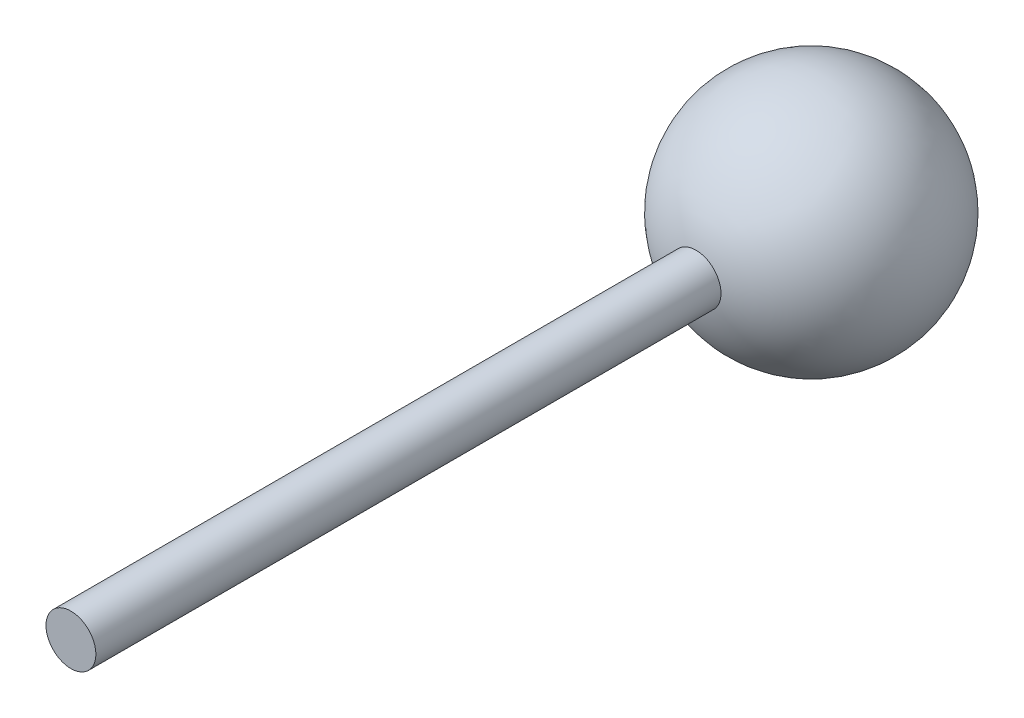
ISO-10303-21;
HEADER;
FILE_DESCRIPTION(('STEP AP214'),'2;1');
FILE_NAME('part.step','',(''),(''),'','','');
FILE_SCHEMA(('AUTOMOTIVE_DESIGN { 1 0 10303 214 1 1 1 1 }'));
ENDSEC;
DATA;
#1=APPLICATION_CONTEXT('core data for automotive mechanical design processes');
#2=APPLICATION_PROTOCOL_DEFINITION('international standard','automotive_design',2000,#1);
#3=PRODUCT_CONTEXT('',#1,'mechanical');
#4=PRODUCT('Part','Part','',(#3));
#5=PRODUCT_RELATED_PRODUCT_CATEGORY('part','',(#4));
#6=PRODUCT_DEFINITION_FORMATION('','',#4);
#7=PRODUCT_DEFINITION_CONTEXT('part definition',#1,'design');
#8=PRODUCT_DEFINITION('design','',#6,#7);
#9=PRODUCT_DEFINITION_SHAPE('','',#8);
#10=(LENGTH_UNIT() NAMED_UNIT(*) SI_UNIT(.MILLI.,.METRE.));
#11=(NAMED_UNIT(*) PLANE_ANGLE_UNIT() SI_UNIT($,.RADIAN.));
#12=(NAMED_UNIT(*) SI_UNIT($,.STERADIAN.) SOLID_ANGLE_UNIT());
#13=UNCERTAINTY_MEASURE_WITH_UNIT(LENGTH_MEASURE(1.E-05),#10,'distance_accuracy_value','');
#14=(GEOMETRIC_REPRESENTATION_CONTEXT(3) GLOBAL_UNCERTAINTY_ASSIGNED_CONTEXT((#13)) GLOBAL_UNIT_ASSIGNED_CONTEXT((#10,
#11,#12)) REPRESENTATION_CONTEXT('',''));
#15=CARTESIAN_POINT('',(0.,0.,0.));
#16=DIRECTION('',(0.,0.,1.));
#17=DIRECTION('',(1.,0.,0.));
#18=AXIS2_PLACEMENT_3D('',#15,#16,#17);
#19=CARTESIAN_POINT('',(0.,0.,0.));
#20=DIRECTION('',(0.,0.,-1.));
#21=DIRECTION('',(1.,0.,0.));
#22=AXIS2_PLACEMENT_3D('',#19,#20,#21);
#23=SPHERICAL_SURFACE('',#22,28.377137051615);
#24=CARTESIAN_POINT('',(0.,0.,27.735571154136));
#25=DIRECTION('',(0.,0.,-1.));
#26=DIRECTION('',(-1.,0.,0.));
#27=AXIS2_PLACEMENT_3D('',#24,#25,#26);
#28=CIRCLE('',#27,5.99999999999999);
#29=CARTESIAN_POINT('',(-5.99999999999999,0.,27.735571154136));
#30=VERTEX_POINT('',#29);
#31=EDGE_CURVE('E10',#30,#30,#28,.T.);
#32=ORIENTED_EDGE('',*,*,#31,.T.);
#33=EDGE_LOOP('',(#32));
#34=FACE_BOUND('',#33,.T.);
#35=ADVANCED_FACE('F31',(#34),#23,.T.);
#36=CARTESIAN_POINT('',(0.,0.,-28.3771370516149));
#37=DIRECTION('',(0.,0.,-1.));
#38=DIRECTION('',(-1.,0.,0.));
#39=AXIS2_PLACEMENT_3D('',#36,#37,#38);
#40=CYLINDRICAL_SURFACE('',#39,5.99999999999999);
#41=CARTESIAN_POINT('',(0.,0.,178.179120791757));
#42=DIRECTION('',(0.,0.,-1.));
#43=DIRECTION('',(-1.,0.,0.));
#44=AXIS2_PLACEMENT_3D('',#41,#42,#43);
#45=CIRCLE('',#44,6.);
#46=CARTESIAN_POINT('',(-6.,0.,178.179120791757));
#47=VERTEX_POINT('',#46);
#48=EDGE_CURVE('E37',#47,#47,#45,.T.);
#49=ORIENTED_EDGE('',*,*,#48,.T.);
#50=EDGE_LOOP('',(#49));
#51=FACE_BOUND('',#50,.T.);
#52=ORIENTED_EDGE('',*,*,#31,.F.);
#53=EDGE_LOOP('',(#52));
#54=FACE_BOUND('',#53,.T.);
#55=ADVANCED_FACE('F43',(#51,#54),#40,.T.);
#56=CARTESIAN_POINT('',(0.,0.,178.179120791757));
#57=DIRECTION('',(0.,0.,1.));
#58=DIRECTION('',(1.,0.,0.));
#59=AXIS2_PLACEMENT_3D('',#56,#57,#58);
#60=PLANE('',#59);
#61=ORIENTED_EDGE('',*,*,#48,.F.);
#62=EDGE_LOOP('',(#61));
#63=FACE_BOUND('',#62,.T.);
#64=ADVANCED_FACE('F46',(#63),#60,.T.);
#65=CLOSED_SHELL('',(#35,#55,#64));
#66=MANIFOLD_SOLID_BREP('B2',#65);
#67=ADVANCED_BREP_SHAPE_REPRESENTATION('',(#18,#66),#14);
#68=SHAPE_DEFINITION_REPRESENTATION(#9,#67);
ENDSEC;
END-ISO-10303-21;
